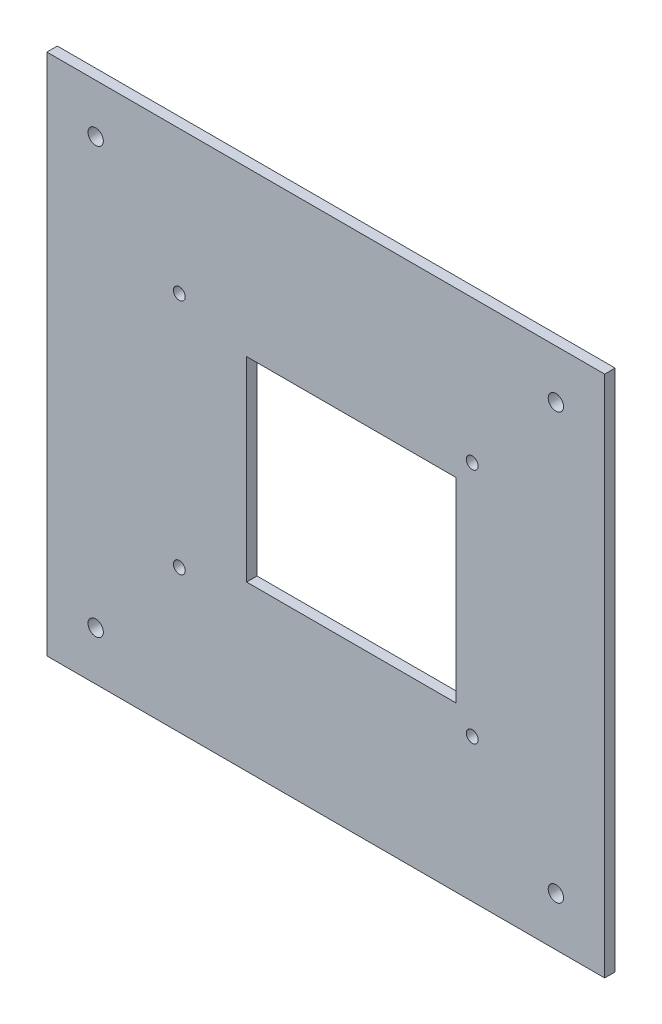
ISO-10303-21;
HEADER;
FILE_DESCRIPTION(('STEP AP214'),'2;1');
FILE_NAME('part.step','',(''),(''),'','','');
FILE_SCHEMA(('AUTOMOTIVE_DESIGN { 1 0 10303 214 1 1 1 1 }'));
ENDSEC;
DATA;
#1=APPLICATION_CONTEXT('core data for automotive mechanical design processes');
#2=APPLICATION_PROTOCOL_DEFINITION('international standard','automotive_design',2000,#1);
#3=PRODUCT_CONTEXT('',#1,'mechanical');
#4=PRODUCT('Part','Part','',(#3));
#5=PRODUCT_RELATED_PRODUCT_CATEGORY('part','',(#4));
#6=PRODUCT_DEFINITION_FORMATION('','',#4);
#7=PRODUCT_DEFINITION_CONTEXT('part definition',#1,'design');
#8=PRODUCT_DEFINITION('design','',#6,#7);
#9=PRODUCT_DEFINITION_SHAPE('','',#8);
#10=(LENGTH_UNIT() NAMED_UNIT(*) SI_UNIT(.MILLI.,.METRE.));
#11=(NAMED_UNIT(*) PLANE_ANGLE_UNIT() SI_UNIT($,.RADIAN.));
#12=(NAMED_UNIT(*) SI_UNIT($,.STERADIAN.) SOLID_ANGLE_UNIT());
#13=UNCERTAINTY_MEASURE_WITH_UNIT(LENGTH_MEASURE(1.E-05),#10,'distance_accuracy_value','');
#14=(GEOMETRIC_REPRESENTATION_CONTEXT(3) GLOBAL_UNCERTAINTY_ASSIGNED_CONTEXT((#13)) GLOBAL_UNIT_ASSIGNED_CONTEXT((#10,
#11,#12)) REPRESENTATION_CONTEXT('',''));
#15=CARTESIAN_POINT('',(0.,0.,0.));
#16=DIRECTION('',(0.,0.,1.));
#17=DIRECTION('',(1.,0.,0.));
#18=AXIS2_PLACEMENT_3D('',#15,#16,#17);
#19=CARTESIAN_POINT('',(58.,53.,0.));
#20=DIRECTION('',(0.,0.,1.));
#21=DIRECTION('',(1.,0.,0.));
#22=AXIS2_PLACEMENT_3D('',#19,#20,#21);
#23=PLANE('',#22);
#24=CARTESIAN_POINT('',(66.,61.,0.));
#25=DIRECTION('',(0.,0.,1.));
#26=DIRECTION('',(1.,0.,0.));
#27=AXIS2_PLACEMENT_3D('',#24,#25,#26);
#28=CIRCLE('',#27,2.2);
#29=CARTESIAN_POINT('',(68.2,61.,0.));
#30=VERTEX_POINT('',#29);
#31=EDGE_CURVE('E333',#30,#30,#28,.T.);
#32=ORIENTED_EDGE('',*,*,#31,.T.);
#33=EDGE_LOOP('',(#32));
#34=FACE_BOUND('',#33,.T.);
#35=DIRECTION('',(1.,0.,0.));
#36=VECTOR('',#35,1.);
#37=CARTESIAN_POINT('',(58.,69.,0.));
#38=LINE('',#37,#36);
#39=CARTESIAN_POINT('',(58.,69.,0.));
#40=VERTEX_POINT('',#39);
#41=CARTESIAN_POINT('',(74.,69.,0.));
#42=VERTEX_POINT('',#41);
#43=EDGE_CURVE('E404',#40,#42,#38,.T.);
#44=ORIENTED_EDGE('',*,*,#43,.T.);
#45=DIRECTION('',(0.,1.,0.));
#46=VECTOR('',#45,1.);
#47=CARTESIAN_POINT('',(74.,53.,0.));
#48=LINE('',#47,#46);
#49=CARTESIAN_POINT('',(74.,53.,0.));
#50=VERTEX_POINT('',#49);
#51=EDGE_CURVE('E11',#50,#42,#48,.T.);
#52=ORIENTED_EDGE('',*,*,#51,.F.);
#53=DIRECTION('',(1.,0.,0.));
#54=VECTOR('',#53,1.);
#55=CARTESIAN_POINT('',(58.,53.,0.));
#56=LINE('',#55,#54);
#57=CARTESIAN_POINT('',(58.,53.,0.));
#58=VERTEX_POINT('',#57);
#59=EDGE_CURVE('E25',#58,#50,#56,.T.);
#60=ORIENTED_EDGE('',*,*,#59,.F.);
#61=DIRECTION('',(0.,1.,0.));
#62=VECTOR('',#61,1.);
#63=CARTESIAN_POINT('',(58.,53.,0.));
#64=LINE('',#63,#62);
#65=EDGE_CURVE('E400',#58,#40,#64,.T.);
#66=ORIENTED_EDGE('',*,*,#65,.T.);
#67=EDGE_LOOP('',(#44,#52,#60,#66));
#68=FACE_BOUND('',#67,.T.);
#69=ADVANCED_FACE('F17',(#34,#68),#23,.F.);
#70=CARTESIAN_POINT('',(-74.,53.,0.));
#71=DIRECTION('',(0.,0.,1.));
#72=DIRECTION('',(1.,0.,0.));
#73=AXIS2_PLACEMENT_3D('',#70,#71,#72);
#74=PLANE('',#73);
#75=CARTESIAN_POINT('',(-66.,61.,0.));
#76=DIRECTION('',(0.,0.,1.));
#77=DIRECTION('',(1.,0.,0.));
#78=AXIS2_PLACEMENT_3D('',#75,#76,#77);
#79=CIRCLE('',#78,2.2);
#80=CARTESIAN_POINT('',(-63.8,61.,0.));
#81=VERTEX_POINT('',#80);
#82=EDGE_CURVE('E307',#81,#81,#79,.T.);
#83=ORIENTED_EDGE('',*,*,#82,.T.);
#84=EDGE_LOOP('',(#83));
#85=FACE_BOUND('',#84,.T.);
#86=DIRECTION('',(1.,0.,0.));
#87=VECTOR('',#86,1.);
#88=CARTESIAN_POINT('',(-74.,69.,0.));
#89=LINE('',#88,#87);
#90=CARTESIAN_POINT('',(-74.,69.,0.));
#91=VERTEX_POINT('',#90);
#92=CARTESIAN_POINT('',(-58.,69.,0.));
#93=VERTEX_POINT('',#92);
#94=EDGE_CURVE('E385',#91,#93,#89,.T.);
#95=ORIENTED_EDGE('',*,*,#94,.T.);
#96=DIRECTION('',(0.,1.,0.));
#97=VECTOR('',#96,1.);
#98=CARTESIAN_POINT('',(-58.,53.,0.));
#99=LINE('',#98,#97);
#100=CARTESIAN_POINT('',(-58.,53.,0.));
#101=VERTEX_POINT('',#100);
#102=EDGE_CURVE('E394',#101,#93,#99,.T.);
#103=ORIENTED_EDGE('',*,*,#102,.F.);
#104=DIRECTION('',(1.,0.,0.));
#105=VECTOR('',#104,1.);
#106=CARTESIAN_POINT('',(-74.,53.,0.));
#107=LINE('',#106,#105);
#108=CARTESIAN_POINT('',(-74.,53.,0.));
#109=VERTEX_POINT('',#108);
#110=EDGE_CURVE('E389',#109,#101,#107,.T.);
#111=ORIENTED_EDGE('',*,*,#110,.F.);
#112=DIRECTION('',(0.,1.,0.));
#113=VECTOR('',#112,1.);
#114=CARTESIAN_POINT('',(-74.,53.,0.));
#115=LINE('',#114,#113);
#116=EDGE_CURVE('E378',#109,#91,#115,.T.);
#117=ORIENTED_EDGE('',*,*,#116,.T.);
#118=EDGE_LOOP('',(#95,#103,#111,#117));
#119=FACE_BOUND('',#118,.T.);
#120=ADVANCED_FACE('F726',(#85,#119),#74,.F.);
#121=CARTESIAN_POINT('',(58.,-69.,0.));
#122=DIRECTION('',(0.,0.,1.));
#123=DIRECTION('',(1.,0.,0.));
#124=AXIS2_PLACEMENT_3D('',#121,#122,#123);
#125=PLANE('',#124);
#126=CARTESIAN_POINT('',(66.,-61.,0.));
#127=DIRECTION('',(0.,0.,1.));
#128=DIRECTION('',(1.,0.,0.));
#129=AXIS2_PLACEMENT_3D('',#126,#127,#128);
#130=CIRCLE('',#129,2.2);
#131=CARTESIAN_POINT('',(68.2,-61.,0.));
#132=VERTEX_POINT('',#131);
#133=EDGE_CURVE('E310',#132,#132,#130,.T.);
#134=ORIENTED_EDGE('',*,*,#133,.T.);
#135=EDGE_LOOP('',(#134));
#136=FACE_BOUND('',#135,.T.);
#137=DIRECTION('',(1.,0.,0.));
#138=VECTOR('',#137,1.);
#139=CARTESIAN_POINT('',(58.,-53.,0.));
#140=LINE('',#139,#138);
#141=CARTESIAN_POINT('',(58.,-53.,0.));
#142=VERTEX_POINT('',#141);
#143=CARTESIAN_POINT('',(74.,-53.,0.));
#144=VERTEX_POINT('',#143);
#145=EDGE_CURVE('E358',#142,#144,#140,.T.);
#146=ORIENTED_EDGE('',*,*,#145,.T.);
#147=DIRECTION('',(0.,1.,0.));
#148=VECTOR('',#147,1.);
#149=CARTESIAN_POINT('',(74.,-69.,0.));
#150=LINE('',#149,#148);
#151=CARTESIAN_POINT('',(74.,-69.,0.));
#152=VERTEX_POINT('',#151);
#153=EDGE_CURVE('E372',#152,#144,#150,.T.);
#154=ORIENTED_EDGE('',*,*,#153,.F.);
#155=DIRECTION('',(1.,0.,0.));
#156=VECTOR('',#155,1.);
#157=CARTESIAN_POINT('',(58.,-69.,0.));
#158=LINE('',#157,#156);
#159=CARTESIAN_POINT('',(58.,-69.,0.));
#160=VERTEX_POINT('',#159);
#161=EDGE_CURVE('E368',#160,#152,#158,.T.);
#162=ORIENTED_EDGE('',*,*,#161,.F.);
#163=DIRECTION('',(0.,1.,0.));
#164=VECTOR('',#163,1.);
#165=CARTESIAN_POINT('',(58.,-69.,0.));
#166=LINE('',#165,#164);
#167=EDGE_CURVE('E353',#160,#142,#166,.T.);
#168=ORIENTED_EDGE('',*,*,#167,.T.);
#169=EDGE_LOOP('',(#146,#154,#162,#168));
#170=FACE_BOUND('',#169,.T.);
#171=ADVANCED_FACE('F731',(#136,#170),#125,.F.);
#172=CARTESIAN_POINT('',(-74.,-69.,0.));
#173=DIRECTION('',(0.,0.,1.));
#174=DIRECTION('',(1.,0.,0.));
#175=AXIS2_PLACEMENT_3D('',#172,#173,#174);
#176=PLANE('',#175);
#177=CARTESIAN_POINT('',(-66.,-61.,0.));
#178=DIRECTION('',(0.,0.,1.));
#179=DIRECTION('',(1.,0.,0.));
#180=AXIS2_PLACEMENT_3D('',#177,#178,#179);
#181=CIRCLE('',#180,2.2);
#182=CARTESIAN_POINT('',(-63.8,-61.,0.));
#183=VERTEX_POINT('',#182);
#184=EDGE_CURVE('E456',#183,#183,#181,.T.);
#185=ORIENTED_EDGE('',*,*,#184,.T.);
#186=EDGE_LOOP('',(#185));
#187=FACE_BOUND('',#186,.T.);
#188=DIRECTION('',(1.,0.,0.));
#189=VECTOR('',#188,1.);
#190=CARTESIAN_POINT('',(-74.,-53.,0.));
#191=LINE('',#190,#189);
#192=CARTESIAN_POINT('',(-74.,-53.,0.));
#193=VERTEX_POINT('',#192);
#194=CARTESIAN_POINT('',(-58.,-53.,0.));
#195=VERTEX_POINT('',#194);
#196=EDGE_CURVE('E340',#193,#195,#191,.T.);
#197=ORIENTED_EDGE('',*,*,#196,.T.);
#198=DIRECTION('',(0.,1.,0.));
#199=VECTOR('',#198,1.);
#200=CARTESIAN_POINT('',(-58.,-69.,0.));
#201=LINE('',#200,#199);
#202=CARTESIAN_POINT('',(-58.,-69.,0.));
#203=VERTEX_POINT('',#202);
#204=EDGE_CURVE('E347',#203,#195,#201,.T.);
#205=ORIENTED_EDGE('',*,*,#204,.F.);
#206=DIRECTION('',(1.,0.,0.));
#207=VECTOR('',#206,1.);
#208=CARTESIAN_POINT('',(-74.,-69.,0.));
#209=LINE('',#208,#207);
#210=CARTESIAN_POINT('',(-74.,-69.,0.));
#211=VERTEX_POINT('',#210);
#212=EDGE_CURVE('E343',#211,#203,#209,.T.);
#213=ORIENTED_EDGE('',*,*,#212,.F.);
#214=DIRECTION('',(0.,1.,0.));
#215=VECTOR('',#214,1.);
#216=CARTESIAN_POINT('',(-74.,-69.,0.));
#217=LINE('',#216,#215);
#218=EDGE_CURVE('E332',#211,#193,#217,.T.);
#219=ORIENTED_EDGE('',*,*,#218,.T.);
#220=EDGE_LOOP('',(#197,#205,#213,#219));
#221=FACE_BOUND('',#220,.T.);
#222=ADVANCED_FACE('F642',(#187,#221),#176,.F.);
#223=CARTESIAN_POINT('',(74.,53.,0.));
#224=DIRECTION('',(1.,0.,0.));
#225=DIRECTION('',(0.,1.,0.));
#226=AXIS2_PLACEMENT_3D('',#223,#224,#225);
#227=PLANE('',#226);
#228=DIRECTION('',(0.,0.,1.));
#229=VECTOR('',#228,1.);
#230=CARTESIAN_POINT('',(74.,53.,0.));
#231=LINE('',#230,#229);
#232=CARTESIAN_POINT('',(74.,53.,6.));
#233=VERTEX_POINT('',#232);
#234=EDGE_CURVE('E408',#50,#233,#231,.T.);
#235=ORIENTED_EDGE('',*,*,#234,.F.);
#236=ORIENTED_EDGE('',*,*,#51,.T.);
#237=DIRECTION('',(0.,0.,1.));
#238=VECTOR('',#237,1.);
#239=CARTESIAN_POINT('',(74.,69.,0.));
#240=LINE('',#239,#238);
#241=CARTESIAN_POINT('',(74.,69.,6.));
#242=VERTEX_POINT('',#241);
#243=EDGE_CURVE('E406',#42,#242,#240,.T.);
#244=ORIENTED_EDGE('',*,*,#243,.T.);
#245=DIRECTION('',(0.,1.,0.));
#246=VECTOR('',#245,1.);
#247=CARTESIAN_POINT('',(74.,53.,6.));
#248=LINE('',#247,#246);
#249=EDGE_CURVE('E445',#233,#242,#248,.T.);
#250=ORIENTED_EDGE('',*,*,#249,.F.);
#251=EDGE_LOOP('',(#235,#236,#244,#250));
#252=FACE_BOUND('',#251,.T.);
#253=ADVANCED_FACE('F740',(#252),#227,.T.);
#254=CARTESIAN_POINT('',(58.,53.,0.));
#255=DIRECTION('',(0.,1.,0.));
#256=DIRECTION('',(1.,0.,0.));
#257=AXIS2_PLACEMENT_3D('',#254,#255,#256);
#258=PLANE('',#257);
#259=ORIENTED_EDGE('',*,*,#234,.T.);
#260=DIRECTION('',(1.,0.,0.));
#261=VECTOR('',#260,1.);
#262=CARTESIAN_POINT('',(58.,53.,6.));
#263=LINE('',#262,#261);
#264=CARTESIAN_POINT('',(58.,53.,6.));
#265=VERTEX_POINT('',#264);
#266=EDGE_CURVE('E444',#265,#233,#263,.T.);
#267=ORIENTED_EDGE('',*,*,#266,.F.);
#268=DIRECTION('',(0.,0.,1.));
#269=VECTOR('',#268,1.);
#270=CARTESIAN_POINT('',(58.,53.,0.));
#271=LINE('',#270,#269);
#272=EDGE_CURVE('E401',#58,#265,#271,.T.);
#273=ORIENTED_EDGE('',*,*,#272,.F.);
#274=ORIENTED_EDGE('',*,*,#59,.T.);
#275=EDGE_LOOP('',(#259,#267,#273,#274));
#276=FACE_BOUND('',#275,.T.);
#277=ADVANCED_FACE('F743',(#276),#258,.F.);
#278=CARTESIAN_POINT('',(58.,69.,0.));
#279=DIRECTION('',(0.,1.,0.));
#280=DIRECTION('',(1.,0.,0.));
#281=AXIS2_PLACEMENT_3D('',#278,#279,#280);
#282=PLANE('',#281);
#283=ORIENTED_EDGE('',*,*,#43,.F.);
#284=DIRECTION('',(0.,0.,1.));
#285=VECTOR('',#284,1.);
#286=CARTESIAN_POINT('',(58.,69.,0.));
#287=LINE('',#286,#285);
#288=CARTESIAN_POINT('',(58.,69.,6.));
#289=VERTEX_POINT('',#288);
#290=EDGE_CURVE('E397',#40,#289,#287,.T.);
#291=ORIENTED_EDGE('',*,*,#290,.T.);
#292=DIRECTION('',(1.,0.,0.));
#293=VECTOR('',#292,1.);
#294=CARTESIAN_POINT('',(58.,69.,6.));
#295=LINE('',#294,#293);
#296=EDGE_CURVE('E449',#289,#242,#295,.T.);
#297=ORIENTED_EDGE('',*,*,#296,.T.);
#298=ORIENTED_EDGE('',*,*,#243,.F.);
#299=EDGE_LOOP('',(#283,#291,#297,#298));
#300=FACE_BOUND('',#299,.T.);
#301=ADVANCED_FACE('F738',(#300),#282,.T.);
#302=CARTESIAN_POINT('',(58.,53.,0.));
#303=DIRECTION('',(1.,0.,0.));
#304=DIRECTION('',(0.,1.,0.));
#305=AXIS2_PLACEMENT_3D('',#302,#303,#304);
#306=PLANE('',#305);
#307=DIRECTION('',(0.,1.,0.));
#308=VECTOR('',#307,1.);
#309=CARTESIAN_POINT('',(58.,53.,6.));
#310=LINE('',#309,#308);
#311=EDGE_CURVE('E453',#265,#289,#310,.T.);
#312=ORIENTED_EDGE('',*,*,#311,.T.);
#313=ORIENTED_EDGE('',*,*,#290,.F.);
#314=ORIENTED_EDGE('',*,*,#65,.F.);
#315=ORIENTED_EDGE('',*,*,#272,.T.);
#316=EDGE_LOOP('',(#312,#313,#314,#315));
#317=FACE_BOUND('',#316,.T.);
#318=ADVANCED_FACE('F745',(#317),#306,.F.);
#319=CARTESIAN_POINT('',(-58.,53.,0.));
#320=DIRECTION('',(1.,0.,0.));
#321=DIRECTION('',(0.,1.,0.));
#322=AXIS2_PLACEMENT_3D('',#319,#320,#321);
#323=PLANE('',#322);
#324=DIRECTION('',(0.,0.,1.));
#325=VECTOR('',#324,1.);
#326=CARTESIAN_POINT('',(-58.,53.,0.));
#327=LINE('',#326,#325);
#328=CARTESIAN_POINT('',(-58.,53.,6.));
#329=VERTEX_POINT('',#328);
#330=EDGE_CURVE('E386',#101,#329,#327,.T.);
#331=ORIENTED_EDGE('',*,*,#330,.F.);
#332=ORIENTED_EDGE('',*,*,#102,.T.);
#333=DIRECTION('',(0.,0.,1.));
#334=VECTOR('',#333,1.);
#335=CARTESIAN_POINT('',(-58.,69.,0.));
#336=LINE('',#335,#334);
#337=CARTESIAN_POINT('',(-58.,69.,6.));
#338=VERTEX_POINT('',#337);
#339=EDGE_CURVE('E390',#93,#338,#336,.T.);
#340=ORIENTED_EDGE('',*,*,#339,.T.);
#341=DIRECTION('',(0.,1.,0.));
#342=VECTOR('',#341,1.);
#343=CARTESIAN_POINT('',(-58.,53.,6.));
#344=LINE('',#343,#342);
#345=EDGE_CURVE('E518',#329,#338,#344,.T.);
#346=ORIENTED_EDGE('',*,*,#345,.F.);
#347=EDGE_LOOP('',(#331,#332,#340,#346));
#348=FACE_BOUND('',#347,.T.);
#349=ADVANCED_FACE('F545',(#348),#323,.T.);
#350=CARTESIAN_POINT('',(-74.,53.,0.));
#351=DIRECTION('',(0.,1.,0.));
#352=DIRECTION('',(1.,0.,0.));
#353=AXIS2_PLACEMENT_3D('',#350,#351,#352);
#354=PLANE('',#353);
#355=ORIENTED_EDGE('',*,*,#330,.T.);
#356=DIRECTION('',(1.,0.,0.));
#357=VECTOR('',#356,1.);
#358=CARTESIAN_POINT('',(-74.,53.,6.));
#359=LINE('',#358,#357);
#360=CARTESIAN_POINT('',(-74.,53.,6.));
#361=VERTEX_POINT('',#360);
#362=EDGE_CURVE('E514',#361,#329,#359,.T.);
#363=ORIENTED_EDGE('',*,*,#362,.F.);
#364=DIRECTION('',(0.,0.,1.));
#365=VECTOR('',#364,1.);
#366=CARTESIAN_POINT('',(-74.,53.,0.));
#367=LINE('',#366,#365);
#368=EDGE_CURVE('E382',#109,#361,#367,.T.);
#369=ORIENTED_EDGE('',*,*,#368,.F.);
#370=ORIENTED_EDGE('',*,*,#110,.T.);
#371=EDGE_LOOP('',(#355,#363,#369,#370));
#372=FACE_BOUND('',#371,.T.);
#373=ADVANCED_FACE('F752',(#372),#354,.F.);
#374=CARTESIAN_POINT('',(-74.,69.,0.));
#375=DIRECTION('',(0.,1.,0.));
#376=DIRECTION('',(1.,0.,0.));
#377=AXIS2_PLACEMENT_3D('',#374,#375,#376);
#378=PLANE('',#377);
#379=ORIENTED_EDGE('',*,*,#94,.F.);
#380=DIRECTION('',(0.,0.,1.));
#381=VECTOR('',#380,1.);
#382=CARTESIAN_POINT('',(-74.,69.,0.));
#383=LINE('',#382,#381);
#384=CARTESIAN_POINT('',(-74.,69.,6.));
#385=VERTEX_POINT('',#384);
#386=EDGE_CURVE('E375',#91,#385,#383,.T.);
#387=ORIENTED_EDGE('',*,*,#386,.T.);
#388=DIRECTION('',(1.,0.,0.));
#389=VECTOR('',#388,1.);
#390=CARTESIAN_POINT('',(-74.,69.,6.));
#391=LINE('',#390,#389);
#392=EDGE_CURVE('E522',#385,#338,#391,.T.);
#393=ORIENTED_EDGE('',*,*,#392,.T.);
#394=ORIENTED_EDGE('',*,*,#339,.F.);
#395=EDGE_LOOP('',(#379,#387,#393,#394));
#396=FACE_BOUND('',#395,.T.);
#397=ADVANCED_FACE('F859',(#396),#378,.T.);
#398=CARTESIAN_POINT('',(-74.,53.,0.));
#399=DIRECTION('',(1.,0.,0.));
#400=DIRECTION('',(0.,1.,0.));
#401=AXIS2_PLACEMENT_3D('',#398,#399,#400);
#402=PLANE('',#401);
#403=DIRECTION('',(0.,1.,0.));
#404=VECTOR('',#403,1.);
#405=CARTESIAN_POINT('',(-74.,53.,6.));
#406=LINE('',#405,#404);
#407=EDGE_CURVE('E421',#361,#385,#406,.T.);
#408=ORIENTED_EDGE('',*,*,#407,.T.);
#409=ORIENTED_EDGE('',*,*,#386,.F.);
#410=ORIENTED_EDGE('',*,*,#116,.F.);
#411=ORIENTED_EDGE('',*,*,#368,.T.);
#412=EDGE_LOOP('',(#408,#409,#410,#411));
#413=FACE_BOUND('',#412,.T.);
#414=ADVANCED_FACE('F535',(#413),#402,.F.);
#415=CARTESIAN_POINT('',(74.,-69.,0.));
#416=DIRECTION('',(1.,0.,0.));
#417=DIRECTION('',(0.,1.,0.));
#418=AXIS2_PLACEMENT_3D('',#415,#416,#417);
#419=PLANE('',#418);
#420=DIRECTION('',(0.,0.,1.));
#421=VECTOR('',#420,1.);
#422=CARTESIAN_POINT('',(74.,-69.,0.));
#423=LINE('',#422,#421);
#424=CARTESIAN_POINT('',(74.,-69.,6.));
#425=VERTEX_POINT('',#424);
#426=EDGE_CURVE('E365',#152,#425,#423,.T.);
#427=ORIENTED_EDGE('',*,*,#426,.F.);
#428=ORIENTED_EDGE('',*,*,#153,.T.);
#429=DIRECTION('',(0.,0.,1.));
#430=VECTOR('',#429,1.);
#431=CARTESIAN_POINT('',(74.,-53.,0.));
#432=LINE('',#431,#430);
#433=CARTESIAN_POINT('',(74.,-53.,6.));
#434=VERTEX_POINT('',#433);
#435=EDGE_CURVE('E362',#144,#434,#432,.T.);
#436=ORIENTED_EDGE('',*,*,#435,.T.);
#437=DIRECTION('',(0.,1.,0.));
#438=VECTOR('',#437,1.);
#439=CARTESIAN_POINT('',(74.,-69.,6.));
#440=LINE('',#439,#438);
#441=EDGE_CURVE('E487',#425,#434,#440,.T.);
#442=ORIENTED_EDGE('',*,*,#441,.F.);
#443=EDGE_LOOP('',(#427,#428,#436,#442));
#444=FACE_BOUND('',#443,.T.);
#445=ADVANCED_FACE('F775',(#444),#419,.T.);
#446=CARTESIAN_POINT('',(58.,-69.,0.));
#447=DIRECTION('',(0.,1.,0.));
#448=DIRECTION('',(1.,0.,0.));
#449=AXIS2_PLACEMENT_3D('',#446,#447,#448);
#450=PLANE('',#449);
#451=ORIENTED_EDGE('',*,*,#426,.T.);
#452=DIRECTION('',(1.,0.,0.));
#453=VECTOR('',#452,1.);
#454=CARTESIAN_POINT('',(58.,-69.,6.));
#455=LINE('',#454,#453);
#456=CARTESIAN_POINT('',(58.,-69.,6.));
#457=VERTEX_POINT('',#456);
#458=EDGE_CURVE('E484',#457,#425,#455,.T.);
#459=ORIENTED_EDGE('',*,*,#458,.F.);
#460=DIRECTION('',(0.,0.,1.));
#461=VECTOR('',#460,1.);
#462=CARTESIAN_POINT('',(58.,-69.,0.));
#463=LINE('',#462,#461);
#464=EDGE_CURVE('E357',#160,#457,#463,.T.);
#465=ORIENTED_EDGE('',*,*,#464,.F.);
#466=ORIENTED_EDGE('',*,*,#161,.T.);
#467=EDGE_LOOP('',(#451,#459,#465,#466));
#468=FACE_BOUND('',#467,.T.);
#469=ADVANCED_FACE('F778',(#468),#450,.F.);
#470=CARTESIAN_POINT('',(58.,-53.,0.));
#471=DIRECTION('',(0.,1.,0.));
#472=DIRECTION('',(1.,0.,0.));
#473=AXIS2_PLACEMENT_3D('',#470,#471,#472);
#474=PLANE('',#473);
#475=ORIENTED_EDGE('',*,*,#145,.F.);
#476=DIRECTION('',(0.,0.,1.));
#477=VECTOR('',#476,1.);
#478=CARTESIAN_POINT('',(58.,-53.,0.));
#479=LINE('',#478,#477);
#480=CARTESIAN_POINT('',(58.,-53.,6.));
#481=VERTEX_POINT('',#480);
#482=EDGE_CURVE('E350',#142,#481,#479,.T.);
#483=ORIENTED_EDGE('',*,*,#482,.T.);
#484=DIRECTION('',(1.,0.,0.));
#485=VECTOR('',#484,1.);
#486=CARTESIAN_POINT('',(58.,-53.,6.));
#487=LINE('',#486,#485);
#488=EDGE_CURVE('E491',#481,#434,#487,.T.);
#489=ORIENTED_EDGE('',*,*,#488,.T.);
#490=ORIENTED_EDGE('',*,*,#435,.F.);
#491=EDGE_LOOP('',(#475,#483,#489,#490));
#492=FACE_BOUND('',#491,.T.);
#493=ADVANCED_FACE('F770',(#492),#474,.T.);
#494=CARTESIAN_POINT('',(58.,-69.,0.));
#495=DIRECTION('',(1.,0.,0.));
#496=DIRECTION('',(0.,1.,0.));
#497=AXIS2_PLACEMENT_3D('',#494,#495,#496);
#498=PLANE('',#497);
#499=DIRECTION('',(0.,1.,0.));
#500=VECTOR('',#499,1.);
#501=CARTESIAN_POINT('',(58.,-69.,6.));
#502=LINE('',#501,#500);
#503=EDGE_CURVE('E497',#457,#481,#502,.T.);
#504=ORIENTED_EDGE('',*,*,#503,.T.);
#505=ORIENTED_EDGE('',*,*,#482,.F.);
#506=ORIENTED_EDGE('',*,*,#167,.F.);
#507=ORIENTED_EDGE('',*,*,#464,.T.);
#508=EDGE_LOOP('',(#504,#505,#506,#507));
#509=FACE_BOUND('',#508,.T.);
#510=ADVANCED_FACE('F782',(#509),#498,.F.);
#511=CARTESIAN_POINT('',(-58.,-69.,0.));
#512=DIRECTION('',(1.,0.,0.));
#513=DIRECTION('',(0.,1.,0.));
#514=AXIS2_PLACEMENT_3D('',#511,#512,#513);
#515=PLANE('',#514);
#516=DIRECTION('',(0.,0.,1.));
#517=VECTOR('',#516,1.);
#518=CARTESIAN_POINT('',(-58.,-69.,0.));
#519=LINE('',#518,#517);
#520=CARTESIAN_POINT('',(-58.,-69.,6.));
#521=VERTEX_POINT('',#520);
#522=EDGE_CURVE('E339',#203,#521,#519,.T.);
#523=ORIENTED_EDGE('',*,*,#522,.F.);
#524=ORIENTED_EDGE('',*,*,#204,.T.);
#525=DIRECTION('',(0.,0.,1.));
#526=VECTOR('',#525,1.);
#527=CARTESIAN_POINT('',(-58.,-53.,0.));
#528=LINE('',#527,#526);
#529=CARTESIAN_POINT('',(-58.,-53.,6.));
#530=VERTEX_POINT('',#529);
#531=EDGE_CURVE('E336',#195,#530,#528,.T.);
#532=ORIENTED_EDGE('',*,*,#531,.T.);
#533=DIRECTION('',(0.,1.,0.));
#534=VECTOR('',#533,1.);
#535=CARTESIAN_POINT('',(-58.,-69.,6.));
#536=LINE('',#535,#534);
#537=EDGE_CURVE('E633',#521,#530,#536,.T.);
#538=ORIENTED_EDGE('',*,*,#537,.F.);
#539=EDGE_LOOP('',(#523,#524,#532,#538));
#540=FACE_BOUND('',#539,.T.);
#541=ADVANCED_FACE('F655',(#540),#515,.T.);
#542=CARTESIAN_POINT('',(-74.,-69.,0.));
#543=DIRECTION('',(0.,1.,0.));
#544=DIRECTION('',(1.,0.,0.));
#545=AXIS2_PLACEMENT_3D('',#542,#543,#544);
#546=PLANE('',#545);
#547=ORIENTED_EDGE('',*,*,#522,.T.);
#548=DIRECTION('',(1.,0.,0.));
#549=VECTOR('',#548,1.);
#550=CARTESIAN_POINT('',(-74.,-69.,6.));
#551=LINE('',#550,#549);
#552=CARTESIAN_POINT('',(-74.,-69.,6.));
#553=VERTEX_POINT('',#552);
#554=EDGE_CURVE('E611',#553,#521,#551,.T.);
#555=ORIENTED_EDGE('',*,*,#554,.F.);
#556=DIRECTION('',(0.,0.,1.));
#557=VECTOR('',#556,1.);
#558=CARTESIAN_POINT('',(-74.,-69.,0.));
#559=LINE('',#558,#557);
#560=EDGE_CURVE('E508',#211,#553,#559,.T.);
#561=ORIENTED_EDGE('',*,*,#560,.F.);
#562=ORIENTED_EDGE('',*,*,#212,.T.);
#563=EDGE_LOOP('',(#547,#555,#561,#562));
#564=FACE_BOUND('',#563,.T.);
#565=ADVANCED_FACE('F657',(#564),#546,.F.);
#566=CARTESIAN_POINT('',(-74.,-53.,0.));
#567=DIRECTION('',(0.,1.,0.));
#568=DIRECTION('',(1.,0.,0.));
#569=AXIS2_PLACEMENT_3D('',#566,#567,#568);
#570=PLANE('',#569);
#571=ORIENTED_EDGE('',*,*,#196,.F.);
#572=DIRECTION('',(0.,0.,1.));
#573=VECTOR('',#572,1.);
#574=CARTESIAN_POINT('',(-74.,-53.,0.));
#575=LINE('',#574,#573);
#576=CARTESIAN_POINT('',(-74.,-53.,6.));
#577=VERTEX_POINT('',#576);
#578=EDGE_CURVE('E329',#193,#577,#575,.T.);
#579=ORIENTED_EDGE('',*,*,#578,.T.);
#580=DIRECTION('',(1.,0.,0.));
#581=VECTOR('',#580,1.);
#582=CARTESIAN_POINT('',(-74.,-53.,6.));
#583=LINE('',#582,#581);
#584=EDGE_CURVE('E475',#577,#530,#583,.T.);
#585=ORIENTED_EDGE('',*,*,#584,.T.);
#586=ORIENTED_EDGE('',*,*,#531,.F.);
#587=EDGE_LOOP('',(#571,#579,#585,#586));
#588=FACE_BOUND('',#587,.T.);
#589=ADVANCED_FACE('F650',(#588),#570,.T.);
#590=CARTESIAN_POINT('',(-74.,-69.,0.));
#591=DIRECTION('',(1.,0.,0.));
#592=DIRECTION('',(0.,1.,0.));
#593=AXIS2_PLACEMENT_3D('',#590,#591,#592);
#594=PLANE('',#593);
#595=DIRECTION('',(0.,1.,0.));
#596=VECTOR('',#595,1.);
#597=CARTESIAN_POINT('',(-74.,-69.,6.));
#598=LINE('',#597,#596);
#599=EDGE_CURVE('E477',#553,#577,#598,.T.);
#600=ORIENTED_EDGE('',*,*,#599,.T.);
#601=ORIENTED_EDGE('',*,*,#578,.F.);
#602=ORIENTED_EDGE('',*,*,#218,.F.);
#603=ORIENTED_EDGE('',*,*,#560,.T.);
#604=EDGE_LOOP('',(#600,#601,#602,#603));
#605=FACE_BOUND('',#604,.T.);
#606=ADVANCED_FACE('F645',(#605),#594,.F.);
#607=CARTESIAN_POINT('',(66.,61.,-1.));
#608=DIRECTION('',(0.,0.,1.));
#609=DIRECTION('',(1.,0.,0.));
#610=AXIS2_PLACEMENT_3D('',#607,#608,#609);
#611=CYLINDRICAL_SURFACE('',#610,2.2);
#612=DIRECTION('',(0.,0.,1.));
#613=VECTOR('',#612,1.);
#614=CARTESIAN_POINT('',(68.2,61.,-1.));
#615=LINE('',#614,#613);
#616=CARTESIAN_POINT('',(68.2,61.,9.));
#617=VERTEX_POINT('',#616);
#618=EDGE_CURVE('E327',#30,#617,#615,.T.);
#619=ORIENTED_EDGE('',*,*,#618,.F.);
#620=ORIENTED_EDGE('',*,*,#31,.F.);
#621=ORIENTED_EDGE('',*,*,#618,.T.);
#622=CARTESIAN_POINT('',(66.,61.,9.));
#623=DIRECTION('',(0.,0.,1.));
#624=DIRECTION('',(1.,0.,0.));
#625=AXIS2_PLACEMENT_3D('',#622,#623,#624);
#626=CIRCLE('',#625,2.2);
#627=EDGE_CURVE('E570',#617,#617,#626,.T.);
#628=ORIENTED_EDGE('',*,*,#627,.T.);
#629=EDGE_LOOP('',(#619,#620,#621,#628));
#630=FACE_BOUND('',#629,.T.);
#631=ADVANCED_FACE('F836',(#630),#611,.F.);
#632=CARTESIAN_POINT('',(42.,34.,5.));
#633=DIRECTION('',(0.,0.,1.));
#634=DIRECTION('',(1.,0.,0.));
#635=AXIS2_PLACEMENT_3D('',#632,#633,#634);
#636=CYLINDRICAL_SURFACE('',#635,1.7);
#637=DIRECTION('',(0.,0.,1.));
#638=VECTOR('',#637,1.);
#639=CARTESIAN_POINT('',(43.7,34.,5.));
#640=LINE('',#639,#638);
#641=CARTESIAN_POINT('',(43.7,34.,6.));
#642=VERTEX_POINT('',#641);
#643=CARTESIAN_POINT('',(43.7,34.,9.));
#644=VERTEX_POINT('',#643);
#645=EDGE_CURVE('E324',#642,#644,#640,.T.);
#646=ORIENTED_EDGE('',*,*,#645,.F.);
#647=CARTESIAN_POINT('',(42.,34.,6.));
#648=DIRECTION('',(0.,0.,1.));
#649=DIRECTION('',(1.,0.,0.));
#650=AXIS2_PLACEMENT_3D('',#647,#648,#649);
#651=CIRCLE('',#650,1.7);
#652=EDGE_CURVE('E433',#642,#642,#651,.T.);
#653=ORIENTED_EDGE('',*,*,#652,.F.);
#654=ORIENTED_EDGE('',*,*,#645,.T.);
#655=CARTESIAN_POINT('',(42.,34.,9.));
#656=DIRECTION('',(0.,0.,1.));
#657=DIRECTION('',(1.,0.,0.));
#658=AXIS2_PLACEMENT_3D('',#655,#656,#657);
#659=CIRCLE('',#658,1.7);
#660=EDGE_CURVE('E566',#644,#644,#659,.T.);
#661=ORIENTED_EDGE('',*,*,#660,.T.);
#662=EDGE_LOOP('',(#646,#653,#654,#661));
#663=FACE_BOUND('',#662,.T.);
#664=ADVANCED_FACE('F832',(#663),#636,.F.);
#665=CARTESIAN_POINT('',(-22.7,28.,5.));
#666=DIRECTION('',(0.,1.,0.));
#667=DIRECTION('',(1.,0.,0.));
#668=AXIS2_PLACEMENT_3D('',#665,#666,#667);
#669=PLANE('',#668);
#670=DIRECTION('',(-1.,0.,0.));
#671=VECTOR('',#670,1.);
#672=CARTESIAN_POINT('',(-51.35,28.,9.));
#673=LINE('',#672,#671);
#674=CARTESIAN_POINT('',(37.3,28.,9.));
#675=VERTEX_POINT('',#674);
#676=CARTESIAN_POINT('',(-22.7,28.,9.));
#677=VERTEX_POINT('',#676);
#678=EDGE_CURVE('E605',#675,#677,#673,.T.);
#679=ORIENTED_EDGE('',*,*,#678,.T.);
#680=DIRECTION('',(0.,0.,1.));
#681=VECTOR('',#680,1.);
#682=CARTESIAN_POINT('',(-22.7,28.,5.));
#683=LINE('',#682,#681);
#684=CARTESIAN_POINT('',(-22.7,28.,6.));
#685=VERTEX_POINT('',#684);
#686=EDGE_CURVE('E328',#685,#677,#683,.T.);
#687=ORIENTED_EDGE('',*,*,#686,.F.);
#688=DIRECTION('',(-1.,0.,0.));
#689=VECTOR('',#688,1.);
#690=CARTESIAN_POINT('',(-51.35,28.,6.));
#691=LINE('',#690,#689);
#692=CARTESIAN_POINT('',(37.3,28.,6.));
#693=VERTEX_POINT('',#692);
#694=EDGE_CURVE('E428',#693,#685,#691,.T.);
#695=ORIENTED_EDGE('',*,*,#694,.F.);
#696=DIRECTION('',(0.,0.,1.));
#697=VECTOR('',#696,1.);
#698=CARTESIAN_POINT('',(37.3,28.,5.));
#699=LINE('',#698,#697);
#700=EDGE_CURVE('E455',#693,#675,#699,.T.);
#701=ORIENTED_EDGE('',*,*,#700,.T.);
#702=EDGE_LOOP('',(#679,#687,#695,#701));
#703=FACE_BOUND('',#702,.T.);
#704=ADVANCED_FACE('F828',(#703),#669,.F.);
#705=CARTESIAN_POINT('',(-22.7,-28.,5.));
#706=DIRECTION('',(1.,0.,0.));
#707=DIRECTION('',(0.,1.,0.));
#708=AXIS2_PLACEMENT_3D('',#705,#706,#707);
#709=PLANE('',#708);
#710=DIRECTION('',(0.,0.,1.));
#711=VECTOR('',#710,1.);
#712=CARTESIAN_POINT('',(-22.7,-28.,5.));
#713=LINE('',#712,#711);
#714=CARTESIAN_POINT('',(-22.7,-28.,6.));
#715=VERTEX_POINT('',#714);
#716=CARTESIAN_POINT('',(-22.7,-28.,9.));
#717=VERTEX_POINT('',#716);
#718=EDGE_CURVE('E323',#715,#717,#713,.T.);
#719=ORIENTED_EDGE('',*,*,#718,.F.);
#720=DIRECTION('',(0.,1.,0.));
#721=VECTOR('',#720,1.);
#722=CARTESIAN_POINT('',(-22.7,-51.5,6.));
#723=LINE('',#722,#721);
#724=EDGE_CURVE('E434',#715,#685,#723,.T.);
#725=ORIENTED_EDGE('',*,*,#724,.T.);
#726=ORIENTED_EDGE('',*,*,#686,.T.);
#727=DIRECTION('',(0.,1.,0.));
#728=VECTOR('',#727,1.);
#729=CARTESIAN_POINT('',(-22.7,-51.5,9.));
#730=LINE('',#729,#728);
#731=EDGE_CURVE('E598',#717,#677,#730,.T.);
#732=ORIENTED_EDGE('',*,*,#731,.F.);
#733=EDGE_LOOP('',(#719,#725,#726,#732));
#734=FACE_BOUND('',#733,.T.);
#735=ADVANCED_FACE('F822',(#734),#709,.T.);
#736=CARTESIAN_POINT('',(37.3,-28.,5.));
#737=DIRECTION('',(1.,0.,0.));
#738=DIRECTION('',(0.,1.,0.));
#739=AXIS2_PLACEMENT_3D('',#736,#737,#738);
#740=PLANE('',#739);
#741=DIRECTION('',(0.,1.,0.));
#742=VECTOR('',#741,1.);
#743=CARTESIAN_POINT('',(37.3,-51.5,9.));
#744=LINE('',#743,#742);
#745=CARTESIAN_POINT('',(37.3,-28.,9.));
#746=VERTEX_POINT('',#745);
#747=EDGE_CURVE('E571',#746,#675,#744,.T.);
#748=ORIENTED_EDGE('',*,*,#747,.T.);
#749=ORIENTED_EDGE('',*,*,#700,.F.);
#750=DIRECTION('',(0.,1.,0.));
#751=VECTOR('',#750,1.);
#752=CARTESIAN_POINT('',(37.3,-51.5,6.));
#753=LINE('',#752,#751);
#754=CARTESIAN_POINT('',(37.3,-28.,6.));
#755=VERTEX_POINT('',#754);
#756=EDGE_CURVE('E424',#755,#693,#753,.T.);
#757=ORIENTED_EDGE('',*,*,#756,.F.);
#758=DIRECTION('',(0.,0.,1.));
#759=VECTOR('',#758,1.);
#760=CARTESIAN_POINT('',(37.3,-28.,5.));
#761=LINE('',#760,#759);
#762=EDGE_CURVE('E320',#755,#746,#761,.T.);
#763=ORIENTED_EDGE('',*,*,#762,.T.);
#764=EDGE_LOOP('',(#748,#749,#757,#763));
#765=FACE_BOUND('',#764,.T.);
#766=ADVANCED_FACE('F807',(#765),#740,.F.);
#767=CARTESIAN_POINT('',(-22.7,-28.,5.));
#768=DIRECTION('',(0.,1.,0.));
#769=DIRECTION('',(1.,0.,0.));
#770=AXIS2_PLACEMENT_3D('',#767,#768,#769);
#771=PLANE('',#770);
#772=ORIENTED_EDGE('',*,*,#762,.F.);
#773=DIRECTION('',(-1.,0.,0.));
#774=VECTOR('',#773,1.);
#775=CARTESIAN_POINT('',(-51.35,-28.,6.));
#776=LINE('',#775,#774);
#777=EDGE_CURVE('E429',#755,#715,#776,.T.);
#778=ORIENTED_EDGE('',*,*,#777,.T.);
#779=ORIENTED_EDGE('',*,*,#718,.T.);
#780=DIRECTION('',(-1.,0.,0.));
#781=VECTOR('',#780,1.);
#782=CARTESIAN_POINT('',(-51.35,-28.,9.));
#783=LINE('',#782,#781);
#784=EDGE_CURVE('E594',#746,#717,#783,.T.);
#785=ORIENTED_EDGE('',*,*,#784,.F.);
#786=EDGE_LOOP('',(#772,#778,#779,#785));
#787=FACE_BOUND('',#786,.T.);
#788=ADVANCED_FACE('F804',(#787),#771,.T.);
#789=CARTESIAN_POINT('',(-66.,61.,-1.));
#790=DIRECTION('',(0.,0.,1.));
#791=DIRECTION('',(1.,0.,0.));
#792=AXIS2_PLACEMENT_3D('',#789,#790,#791);
#793=CYLINDRICAL_SURFACE('',#792,2.2);
#794=DIRECTION('',(0.,0.,1.));
#795=VECTOR('',#794,1.);
#796=CARTESIAN_POINT('',(-63.8,61.,-1.));
#797=LINE('',#796,#795);
#798=CARTESIAN_POINT('',(-63.8,61.,9.));
#799=VERTEX_POINT('',#798);
#800=EDGE_CURVE('E300',#81,#799,#797,.T.);
#801=ORIENTED_EDGE('',*,*,#800,.F.);
#802=ORIENTED_EDGE('',*,*,#82,.F.);
#803=ORIENTED_EDGE('',*,*,#800,.T.);
#804=CARTESIAN_POINT('',(-66.,61.,9.));
#805=DIRECTION('',(0.,0.,1.));
#806=DIRECTION('',(1.,0.,0.));
#807=AXIS2_PLACEMENT_3D('',#804,#805,#806);
#808=CIRCLE('',#807,2.2);
#809=EDGE_CURVE('E590',#799,#799,#808,.T.);
#810=ORIENTED_EDGE('',*,*,#809,.T.);
#811=EDGE_LOOP('',(#801,#802,#803,#810));
#812=FACE_BOUND('',#811,.T.);
#813=ADVANCED_FACE('F806',(#812),#793,.F.);
#814=CARTESIAN_POINT('',(-42.,34.,5.));
#815=DIRECTION('',(0.,0.,1.));
#816=DIRECTION('',(1.,0.,0.));
#817=AXIS2_PLACEMENT_3D('',#814,#815,#816);
#818=CYLINDRICAL_SURFACE('',#817,1.7);
#819=DIRECTION('',(0.,0.,1.));
#820=VECTOR('',#819,1.);
#821=CARTESIAN_POINT('',(-40.3,34.,5.));
#822=LINE('',#821,#820);
#823=CARTESIAN_POINT('',(-40.3,34.,6.));
#824=VERTEX_POINT('',#823);
#825=CARTESIAN_POINT('',(-40.3,34.,9.));
#826=VERTEX_POINT('',#825);
#827=EDGE_CURVE('E293',#824,#826,#822,.T.);
#828=ORIENTED_EDGE('',*,*,#827,.F.);
#829=CARTESIAN_POINT('',(-42.,34.,6.));
#830=DIRECTION('',(0.,0.,1.));
#831=DIRECTION('',(1.,0.,0.));
#832=AXIS2_PLACEMENT_3D('',#829,#830,#831);
#833=CIRCLE('',#832,1.7);
#834=EDGE_CURVE('E298',#824,#824,#833,.T.);
#835=ORIENTED_EDGE('',*,*,#834,.F.);
#836=ORIENTED_EDGE('',*,*,#827,.T.);
#837=CARTESIAN_POINT('',(-42.,34.,9.));
#838=DIRECTION('',(0.,0.,1.));
#839=DIRECTION('',(1.,0.,0.));
#840=AXIS2_PLACEMENT_3D('',#837,#838,#839);
#841=CIRCLE('',#840,1.7);
#842=EDGE_CURVE('E296',#826,#826,#841,.T.);
#843=ORIENTED_EDGE('',*,*,#842,.T.);
#844=EDGE_LOOP('',(#828,#835,#836,#843));
#845=FACE_BOUND('',#844,.T.);
#846=ADVANCED_FACE('F294',(#845),#818,.F.);
#847=CARTESIAN_POINT('',(42.,-34.,5.));
#848=DIRECTION('',(0.,0.,1.));
#849=DIRECTION('',(1.,0.,0.));
#850=AXIS2_PLACEMENT_3D('',#847,#848,#849);
#851=CYLINDRICAL_SURFACE('',#850,1.7);
#852=DIRECTION('',(0.,0.,1.));
#853=VECTOR('',#852,1.);
#854=CARTESIAN_POINT('',(43.7,-34.,5.));
#855=LINE('',#854,#853);
#856=CARTESIAN_POINT('',(43.7,-34.,6.));
#857=VERTEX_POINT('',#856);
#858=CARTESIAN_POINT('',(43.7,-34.,9.));
#859=VERTEX_POINT('',#858);
#860=EDGE_CURVE('E301',#857,#859,#855,.T.);
#861=ORIENTED_EDGE('',*,*,#860,.F.);
#862=CARTESIAN_POINT('',(42.,-34.,6.));
#863=DIRECTION('',(0.,0.,1.));
#864=DIRECTION('',(1.,0.,0.));
#865=AXIS2_PLACEMENT_3D('',#862,#863,#864);
#866=CIRCLE('',#865,1.7);
#867=EDGE_CURVE('E504',#857,#857,#866,.T.);
#868=ORIENTED_EDGE('',*,*,#867,.F.);
#869=ORIENTED_EDGE('',*,*,#860,.T.);
#870=CARTESIAN_POINT('',(42.,-34.,9.));
#871=DIRECTION('',(0.,0.,1.));
#872=DIRECTION('',(1.,0.,0.));
#873=AXIS2_PLACEMENT_3D('',#870,#871,#872);
#874=CIRCLE('',#873,1.7);
#875=EDGE_CURVE('E583',#859,#859,#874,.T.);
#876=ORIENTED_EDGE('',*,*,#875,.T.);
#877=EDGE_LOOP('',(#861,#868,#869,#876));
#878=FACE_BOUND('',#877,.T.);
#879=ADVANCED_FACE('F815',(#878),#851,.F.);
#880=CARTESIAN_POINT('',(66.,-61.,-1.));
#881=DIRECTION('',(0.,0.,1.));
#882=DIRECTION('',(1.,0.,0.));
#883=AXIS2_PLACEMENT_3D('',#880,#881,#882);
#884=CYLINDRICAL_SURFACE('',#883,2.2);
#885=DIRECTION('',(0.,0.,1.));
#886=VECTOR('',#885,1.);
#887=CARTESIAN_POINT('',(68.2,-61.,-1.));
#888=LINE('',#887,#886);
#889=CARTESIAN_POINT('',(68.2,-61.,9.));
#890=VERTEX_POINT('',#889);
#891=EDGE_CURVE('E316',#132,#890,#888,.T.);
#892=ORIENTED_EDGE('',*,*,#891,.F.);
#893=ORIENTED_EDGE('',*,*,#133,.F.);
#894=ORIENTED_EDGE('',*,*,#891,.T.);
#895=CARTESIAN_POINT('',(66.,-61.,9.));
#896=DIRECTION('',(0.,0.,1.));
#897=DIRECTION('',(1.,0.,0.));
#898=AXIS2_PLACEMENT_3D('',#895,#896,#897);
#899=CIRCLE('',#898,2.2);
#900=EDGE_CURVE('E582',#890,#890,#899,.T.);
#901=ORIENTED_EDGE('',*,*,#900,.T.);
#902=EDGE_LOOP('',(#892,#893,#894,#901));
#903=FACE_BOUND('',#902,.T.);
#904=ADVANCED_FACE('F800',(#903),#884,.F.);
#905=CARTESIAN_POINT('',(-42.,-34.,5.));
#906=DIRECTION('',(0.,0.,1.));
#907=DIRECTION('',(1.,0.,0.));
#908=AXIS2_PLACEMENT_3D('',#905,#906,#907);
#909=CYLINDRICAL_SURFACE('',#908,1.7);
#910=DIRECTION('',(0.,0.,1.));
#911=VECTOR('',#910,1.);
#912=CARTESIAN_POINT('',(-40.3,-34.,5.));
#913=LINE('',#912,#911);
#914=CARTESIAN_POINT('',(-40.3,-34.,6.));
#915=VERTEX_POINT('',#914);
#916=CARTESIAN_POINT('',(-40.3,-34.,9.));
#917=VERTEX_POINT('',#916);
#918=EDGE_CURVE('E314',#915,#917,#913,.T.);
#919=ORIENTED_EDGE('',*,*,#918,.F.);
#920=CARTESIAN_POINT('',(-42.,-34.,6.));
#921=DIRECTION('',(0.,0.,1.));
#922=DIRECTION('',(1.,0.,0.));
#923=AXIS2_PLACEMENT_3D('',#920,#921,#922);
#924=CIRCLE('',#923,1.7);
#925=EDGE_CURVE('E480',#915,#915,#924,.T.);
#926=ORIENTED_EDGE('',*,*,#925,.F.);
#927=ORIENTED_EDGE('',*,*,#918,.T.);
#928=CARTESIAN_POINT('',(-42.,-34.,9.));
#929=DIRECTION('',(0.,0.,1.));
#930=DIRECTION('',(1.,0.,0.));
#931=AXIS2_PLACEMENT_3D('',#928,#929,#930);
#932=CIRCLE('',#931,1.7);
#933=EDGE_CURVE('E574',#917,#917,#932,.T.);
#934=ORIENTED_EDGE('',*,*,#933,.T.);
#935=EDGE_LOOP('',(#919,#926,#927,#934));
#936=FACE_BOUND('',#935,.T.);
#937=ADVANCED_FACE('F787',(#936),#909,.F.);
#938=CARTESIAN_POINT('',(-66.,-61.,-1.));
#939=DIRECTION('',(0.,0.,1.));
#940=DIRECTION('',(1.,0.,0.));
#941=AXIS2_PLACEMENT_3D('',#938,#939,#940);
#942=CYLINDRICAL_SURFACE('',#941,2.2);
#943=DIRECTION('',(0.,0.,1.));
#944=VECTOR('',#943,1.);
#945=CARTESIAN_POINT('',(-63.8,-61.,-1.));
#946=LINE('',#945,#944);
#947=CARTESIAN_POINT('',(-63.8,-61.,9.));
#948=VERTEX_POINT('',#947);
#949=EDGE_CURVE('E458',#183,#948,#946,.T.);
#950=ORIENTED_EDGE('',*,*,#949,.F.);
#951=ORIENTED_EDGE('',*,*,#184,.F.);
#952=ORIENTED_EDGE('',*,*,#949,.T.);
#953=CARTESIAN_POINT('',(-66.,-61.,9.));
#954=DIRECTION('',(0.,0.,1.));
#955=DIRECTION('',(1.,0.,0.));
#956=AXIS2_PLACEMENT_3D('',#953,#954,#955);
#957=CIRCLE('',#956,2.2);
#958=EDGE_CURVE('E572',#948,#948,#957,.T.);
#959=ORIENTED_EDGE('',*,*,#958,.T.);
#960=EDGE_LOOP('',(#950,#951,#952,#959));
#961=FACE_BOUND('',#960,.T.);
#962=ADVANCED_FACE('F792',(#961),#942,.F.);
#963=CARTESIAN_POINT('',(80.,-75.,6.));
#964=DIRECTION('',(1.,0.,0.));
#965=DIRECTION('',(0.,1.,0.));
#966=AXIS2_PLACEMENT_3D('',#963,#964,#965);
#967=PLANE('',#966);
#968=DIRECTION('',(0.,0.,1.));
#969=VECTOR('',#968,1.);
#970=CARTESIAN_POINT('',(80.,-75.,6.));
#971=LINE('',#970,#969);
#972=CARTESIAN_POINT('',(80.,-75.,6.));
#973=VERTEX_POINT('',#972);
#974=CARTESIAN_POINT('',(80.,-75.,9.));
#975=VERTEX_POINT('',#974);
#976=EDGE_CURVE('E556',#973,#975,#971,.T.);
#977=ORIENTED_EDGE('',*,*,#976,.F.);
#978=DIRECTION('',(0.,1.,0.));
#979=VECTOR('',#978,1.);
#980=CARTESIAN_POINT('',(80.,-75.,6.));
#981=LINE('',#980,#979);
#982=CARTESIAN_POINT('',(80.,75.,6.));
#983=VERTEX_POINT('',#982);
#984=EDGE_CURVE('E608',#973,#983,#981,.T.);
#985=ORIENTED_EDGE('',*,*,#984,.T.);
#986=DIRECTION('',(0.,0.,1.));
#987=VECTOR('',#986,1.);
#988=CARTESIAN_POINT('',(80.,75.,6.));
#989=LINE('',#988,#987);
#990=CARTESIAN_POINT('',(80.,75.,9.));
#991=VERTEX_POINT('',#990);
#992=EDGE_CURVE('E612',#983,#991,#989,.T.);
#993=ORIENTED_EDGE('',*,*,#992,.T.);
#994=DIRECTION('',(0.,1.,0.));
#995=VECTOR('',#994,1.);
#996=CARTESIAN_POINT('',(80.,-75.,9.));
#997=LINE('',#996,#995);
#998=EDGE_CURVE('E557',#975,#991,#997,.T.);
#999=ORIENTED_EDGE('',*,*,#998,.F.);
#1000=EDGE_LOOP('',(#977,#985,#993,#999));
#1001=FACE_BOUND('',#1000,.T.);
#1002=ADVANCED_FACE('F666',(#1001),#967,.T.);
#1003=CARTESIAN_POINT('',(-80.,-75.,6.));
#1004=DIRECTION('',(0.,0.,1.));
#1005=DIRECTION('',(1.,0.,0.));
#1006=AXIS2_PLACEMENT_3D('',#1003,#1004,#1005);
#1007=PLANE('',#1006);
#1008=ORIENTED_EDGE('',*,*,#266,.T.);
#1009=ORIENTED_EDGE('',*,*,#249,.T.);
#1010=ORIENTED_EDGE('',*,*,#296,.F.);
#1011=ORIENTED_EDGE('',*,*,#311,.F.);
#1012=EDGE_LOOP('',(#1008,#1009,#1010,#1011));
#1013=FACE_BOUND('',#1012,.T.);
#1014=ORIENTED_EDGE('',*,*,#652,.T.);
#1015=EDGE_LOOP('',(#1014));
#1016=FACE_BOUND('',#1015,.T.);
#1017=ORIENTED_EDGE('',*,*,#756,.T.);
#1018=ORIENTED_EDGE('',*,*,#694,.T.);
#1019=ORIENTED_EDGE('',*,*,#724,.F.);
#1020=ORIENTED_EDGE('',*,*,#777,.F.);
#1021=EDGE_LOOP('',(#1017,#1018,#1019,#1020));
#1022=FACE_BOUND('',#1021,.T.);
#1023=ORIENTED_EDGE('',*,*,#362,.T.);
#1024=ORIENTED_EDGE('',*,*,#345,.T.);
#1025=ORIENTED_EDGE('',*,*,#392,.F.);
#1026=ORIENTED_EDGE('',*,*,#407,.F.);
#1027=EDGE_LOOP('',(#1023,#1024,#1025,#1026));
#1028=FACE_BOUND('',#1027,.T.);
#1029=ORIENTED_EDGE('',*,*,#834,.T.);
#1030=EDGE_LOOP('',(#1029));
#1031=FACE_BOUND('',#1030,.T.);
#1032=ORIENTED_EDGE('',*,*,#867,.T.);
#1033=EDGE_LOOP('',(#1032));
#1034=FACE_BOUND('',#1033,.T.);
#1035=ORIENTED_EDGE('',*,*,#458,.T.);
#1036=ORIENTED_EDGE('',*,*,#441,.T.);
#1037=ORIENTED_EDGE('',*,*,#488,.F.);
#1038=ORIENTED_EDGE('',*,*,#503,.F.);
#1039=EDGE_LOOP('',(#1035,#1036,#1037,#1038));
#1040=FACE_BOUND('',#1039,.T.);
#1041=ORIENTED_EDGE('',*,*,#925,.T.);
#1042=EDGE_LOOP('',(#1041));
#1043=FACE_BOUND('',#1042,.T.);
#1044=ORIENTED_EDGE('',*,*,#554,.T.);
#1045=ORIENTED_EDGE('',*,*,#537,.T.);
#1046=ORIENTED_EDGE('',*,*,#584,.F.);
#1047=ORIENTED_EDGE('',*,*,#599,.F.);
#1048=EDGE_LOOP('',(#1044,#1045,#1046,#1047));
#1049=FACE_BOUND('',#1048,.T.);
#1050=DIRECTION('',(1.,0.,0.));
#1051=VECTOR('',#1050,1.);
#1052=CARTESIAN_POINT('',(-80.,75.,6.));
#1053=LINE('',#1052,#1051);
#1054=CARTESIAN_POINT('',(-80.,75.,6.));
#1055=VERTEX_POINT('',#1054);
#1056=EDGE_CURVE('E622',#1055,#983,#1053,.T.);
#1057=ORIENTED_EDGE('',*,*,#1056,.T.);
#1058=ORIENTED_EDGE('',*,*,#984,.F.);
#1059=DIRECTION('',(1.,0.,0.));
#1060=VECTOR('',#1059,1.);
#1061=CARTESIAN_POINT('',(-80.,-75.,6.));
#1062=LINE('',#1061,#1060);
#1063=CARTESIAN_POINT('',(-80.,-75.,6.));
#1064=VERTEX_POINT('',#1063);
#1065=EDGE_CURVE('E561',#1064,#973,#1062,.T.);
#1066=ORIENTED_EDGE('',*,*,#1065,.F.);
#1067=DIRECTION('',(0.,1.,0.));
#1068=VECTOR('',#1067,1.);
#1069=CARTESIAN_POINT('',(-80.,-75.,6.));
#1070=LINE('',#1069,#1068);
#1071=EDGE_CURVE('E672',#1064,#1055,#1070,.T.);
#1072=ORIENTED_EDGE('',*,*,#1071,.T.);
#1073=EDGE_LOOP('',(#1057,#1058,#1066,#1072));
#1074=FACE_BOUND('',#1073,.T.);
#1075=ADVANCED_FACE('F540',(#1013,#1016,#1022,#1028,#1031,#1034,#1040,#1043,#1049,#1074),#1007,.F.);
#1076=CARTESIAN_POINT('',(-80.,75.,6.));
#1077=DIRECTION('',(0.,1.,0.));
#1078=DIRECTION('',(1.,0.,0.));
#1079=AXIS2_PLACEMENT_3D('',#1076,#1077,#1078);
#1080=PLANE('',#1079);
#1081=ORIENTED_EDGE('',*,*,#1056,.F.);
#1082=DIRECTION('',(0.,0.,1.));
#1083=VECTOR('',#1082,1.);
#1084=CARTESIAN_POINT('',(-80.,75.,6.));
#1085=LINE('',#1084,#1083);
#1086=CARTESIAN_POINT('',(-80.,75.,9.));
#1087=VERTEX_POINT('',#1086);
#1088=EDGE_CURVE('E678',#1055,#1087,#1085,.T.);
#1089=ORIENTED_EDGE('',*,*,#1088,.T.);
#1090=DIRECTION('',(1.,0.,0.));
#1091=VECTOR('',#1090,1.);
#1092=CARTESIAN_POINT('',(-80.,75.,9.));
#1093=LINE('',#1092,#1091);
#1094=EDGE_CURVE('E560',#1087,#991,#1093,.T.);
#1095=ORIENTED_EDGE('',*,*,#1094,.T.);
#1096=ORIENTED_EDGE('',*,*,#992,.F.);
#1097=EDGE_LOOP('',(#1081,#1089,#1095,#1096));
#1098=FACE_BOUND('',#1097,.T.);
#1099=ADVANCED_FACE('F665',(#1098),#1080,.T.);
#1100=CARTESIAN_POINT('',(-80.,-75.,9.));
#1101=DIRECTION('',(0.,0.,1.));
#1102=DIRECTION('',(1.,0.,0.));
#1103=AXIS2_PLACEMENT_3D('',#1100,#1101,#1102);
#1104=PLANE('',#1103);
#1105=ORIENTED_EDGE('',*,*,#627,.F.);
#1106=EDGE_LOOP('',(#1105));
#1107=FACE_BOUND('',#1106,.T.);
#1108=ORIENTED_EDGE('',*,*,#660,.F.);
#1109=EDGE_LOOP('',(#1108));
#1110=FACE_BOUND('',#1109,.T.);
#1111=ORIENTED_EDGE('',*,*,#784,.T.);
#1112=ORIENTED_EDGE('',*,*,#731,.T.);
#1113=ORIENTED_EDGE('',*,*,#678,.F.);
#1114=ORIENTED_EDGE('',*,*,#747,.F.);
#1115=EDGE_LOOP('',(#1111,#1112,#1113,#1114));
#1116=FACE_BOUND('',#1115,.T.);
#1117=ORIENTED_EDGE('',*,*,#809,.F.);
#1118=EDGE_LOOP('',(#1117));
#1119=FACE_BOUND('',#1118,.T.);
#1120=ORIENTED_EDGE('',*,*,#842,.F.);
#1121=EDGE_LOOP('',(#1120));
#1122=FACE_BOUND('',#1121,.T.);
#1123=ORIENTED_EDGE('',*,*,#875,.F.);
#1124=EDGE_LOOP('',(#1123));
#1125=FACE_BOUND('',#1124,.T.);
#1126=ORIENTED_EDGE('',*,*,#900,.F.);
#1127=EDGE_LOOP('',(#1126));
#1128=FACE_BOUND('',#1127,.T.);
#1129=ORIENTED_EDGE('',*,*,#933,.F.);
#1130=EDGE_LOOP('',(#1129));
#1131=FACE_BOUND('',#1130,.T.);
#1132=ORIENTED_EDGE('',*,*,#958,.F.);
#1133=EDGE_LOOP('',(#1132));
#1134=FACE_BOUND('',#1133,.T.);
#1135=DIRECTION('',(0.,1.,0.));
#1136=VECTOR('',#1135,1.);
#1137=CARTESIAN_POINT('',(-80.,-75.,9.));
#1138=LINE('',#1137,#1136);
#1139=CARTESIAN_POINT('',(-80.,-75.,9.));
#1140=VERTEX_POINT('',#1139);
#1141=EDGE_CURVE('E706',#1140,#1087,#1138,.T.);
#1142=ORIENTED_EDGE('',*,*,#1141,.F.);
#1143=DIRECTION('',(1.,0.,0.));
#1144=VECTOR('',#1143,1.);
#1145=CARTESIAN_POINT('',(-80.,-75.,9.));
#1146=LINE('',#1145,#1144);
#1147=EDGE_CURVE('E562',#1140,#975,#1146,.T.);
#1148=ORIENTED_EDGE('',*,*,#1147,.T.);
#1149=ORIENTED_EDGE('',*,*,#998,.T.);
#1150=ORIENTED_EDGE('',*,*,#1094,.F.);
#1151=EDGE_LOOP('',(#1142,#1148,#1149,#1150));
#1152=FACE_BOUND('',#1151,.T.);
#1153=ADVANCED_FACE('F713',(#1107,#1110,#1116,#1119,#1122,#1125,#1128,#1131,#1134,#1152),#1104,.T.);
#1154=CARTESIAN_POINT('',(-80.,-75.,6.));
#1155=DIRECTION('',(0.,1.,0.));
#1156=DIRECTION('',(1.,0.,0.));
#1157=AXIS2_PLACEMENT_3D('',#1154,#1155,#1156);
#1158=PLANE('',#1157);
#1159=ORIENTED_EDGE('',*,*,#976,.T.);
#1160=ORIENTED_EDGE('',*,*,#1147,.F.);
#1161=DIRECTION('',(0.,0.,1.));
#1162=VECTOR('',#1161,1.);
#1163=CARTESIAN_POINT('',(-80.,-75.,6.));
#1164=LINE('',#1163,#1162);
#1165=EDGE_CURVE('E684',#1064,#1140,#1164,.T.);
#1166=ORIENTED_EDGE('',*,*,#1165,.F.);
#1167=ORIENTED_EDGE('',*,*,#1065,.T.);
#1168=EDGE_LOOP('',(#1159,#1160,#1166,#1167));
#1169=FACE_BOUND('',#1168,.T.);
#1170=ADVANCED_FACE('F714',(#1169),#1158,.F.);
#1171=CARTESIAN_POINT('',(-80.,-75.,6.));
#1172=DIRECTION('',(1.,0.,0.));
#1173=DIRECTION('',(0.,1.,0.));
#1174=AXIS2_PLACEMENT_3D('',#1171,#1172,#1173);
#1175=PLANE('',#1174);
#1176=ORIENTED_EDGE('',*,*,#1141,.T.);
#1177=ORIENTED_EDGE('',*,*,#1088,.F.);
#1178=ORIENTED_EDGE('',*,*,#1071,.F.);
#1179=ORIENTED_EDGE('',*,*,#1165,.T.);
#1180=EDGE_LOOP('',(#1176,#1177,#1178,#1179));
#1181=FACE_BOUND('',#1180,.T.);
#1182=ADVANCED_FACE('F711',(#1181),#1175,.F.);
#1183=CLOSED_SHELL('',(#69,#120,#171,#222,#253,#277,#301,#318,#349,#373,#397,#414,#445,#469,
#493,#510,#541,#565,#589,#606,#631,#664,#704,#735,#766,#788,#813,#846,#879,#904,#937,#962,#1002,
#1075,#1099,#1153,#1170,#1182));
#1184=MANIFOLD_SOLID_BREP('B1',#1183);
#1185=ADVANCED_BREP_SHAPE_REPRESENTATION('',(#18,#1184),#14);
#1186=SHAPE_DEFINITION_REPRESENTATION(#9,#1185);
ENDSEC;
END-ISO-10303-21;
